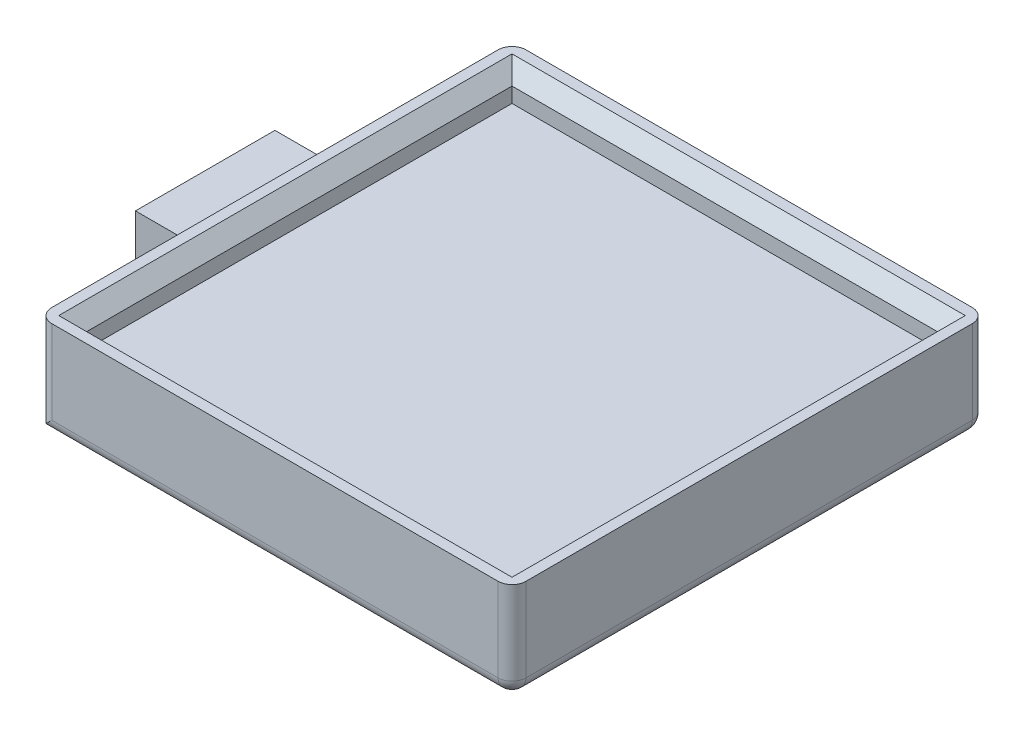
ISO-10303-21;
HEADER;
FILE_DESCRIPTION(('STEP AP214'),'2;1');
FILE_NAME('part.step','',(''),(''),'','','');
FILE_SCHEMA(('AUTOMOTIVE_DESIGN { 1 0 10303 214 1 1 1 1 }'));
ENDSEC;
DATA;
#1=APPLICATION_CONTEXT('core data for automotive mechanical design processes');
#2=APPLICATION_PROTOCOL_DEFINITION('international standard','automotive_design',2000,#1);
#3=PRODUCT_CONTEXT('',#1,'mechanical');
#4=PRODUCT('Part','Part','',(#3));
#5=PRODUCT_RELATED_PRODUCT_CATEGORY('part','',(#4));
#6=PRODUCT_DEFINITION_FORMATION('','',#4);
#7=PRODUCT_DEFINITION_CONTEXT('part definition',#1,'design');
#8=PRODUCT_DEFINITION('design','',#6,#7);
#9=PRODUCT_DEFINITION_SHAPE('','',#8);
#10=(LENGTH_UNIT() NAMED_UNIT(*) SI_UNIT(.MILLI.,.METRE.));
#11=(NAMED_UNIT(*) PLANE_ANGLE_UNIT() SI_UNIT($,.RADIAN.));
#12=(NAMED_UNIT(*) SI_UNIT($,.STERADIAN.) SOLID_ANGLE_UNIT());
#13=UNCERTAINTY_MEASURE_WITH_UNIT(LENGTH_MEASURE(1.E-05),#10,'distance_accuracy_value','');
#14=(GEOMETRIC_REPRESENTATION_CONTEXT(3) GLOBAL_UNCERTAINTY_ASSIGNED_CONTEXT((#13)) GLOBAL_UNIT_ASSIGNED_CONTEXT((#10,
#11,#12)) REPRESENTATION_CONTEXT('',''));
#15=CARTESIAN_POINT('',(0.,0.,0.));
#16=DIRECTION('',(0.,0.,1.));
#17=DIRECTION('',(1.,0.,0.));
#18=AXIS2_PLACEMENT_3D('',#15,#16,#17);
#19=CARTESIAN_POINT('',(0.,5.,0.));
#20=DIRECTION('',(0.,-1.,0.));
#21=DIRECTION('',(0.,0.,-1.));
#22=AXIS2_PLACEMENT_3D('',#19,#20,#21);
#23=PLANE('',#22);
#24=DIRECTION('',(0.,0.,1.));
#25=VECTOR('',#24,1.);
#26=CARTESIAN_POINT('',(5.,5.,0.));
#27=LINE('',#26,#25);
#28=CARTESIAN_POINT('',(5.,5.,-10.));
#29=VERTEX_POINT('',#28);
#30=CARTESIAN_POINT('',(5.,5.,0.));
#31=VERTEX_POINT('',#30);
#32=EDGE_CURVE('E268',#29,#31,#27,.T.);
#33=ORIENTED_EDGE('',*,*,#32,.F.);
#34=DIRECTION('',(1.,0.,0.));
#35=VECTOR('',#34,1.);
#36=CARTESIAN_POINT('',(0.,5.,-10.));
#37=LINE('',#36,#35);
#38=CARTESIAN_POINT('',(0.,5.,-10.));
#39=VERTEX_POINT('',#38);
#40=EDGE_CURVE('E282',#39,#29,#37,.T.);
#41=ORIENTED_EDGE('',*,*,#40,.F.);
#42=DIRECTION('',(0.,0.,-1.));
#43=VECTOR('',#42,1.);
#44=CARTESIAN_POINT('',(0.,5.,0.));
#45=LINE('',#44,#43);
#46=CARTESIAN_POINT('',(0.,5.,0.));
#47=VERTEX_POINT('',#46);
#48=EDGE_CURVE('E277',#47,#39,#45,.T.);
#49=ORIENTED_EDGE('',*,*,#48,.F.);
#50=DIRECTION('',(-1.,0.,0.));
#51=VECTOR('',#50,1.);
#52=CARTESIAN_POINT('',(5.,5.,0.));
#53=LINE('',#52,#51);
#54=EDGE_CURVE('E273',#31,#47,#53,.T.);
#55=ORIENTED_EDGE('',*,*,#54,.F.);
#56=EDGE_LOOP('',(#33,#41,#49,#55));
#57=FACE_BOUND('',#56,.T.);
#58=ADVANCED_FACE('F73',(#57),#23,.F.);
#59=CARTESIAN_POINT('',(5.,5.,0.));
#60=DIRECTION('',(0.,0.,1.));
#61=DIRECTION('',(1.,0.,0.));
#62=AXIS2_PLACEMENT_3D('',#59,#60,#61);
#63=PLANE('',#62);
#64=DIRECTION('',(-1.,0.,0.));
#65=VECTOR('',#64,1.);
#66=CARTESIAN_POINT('',(5.,0.,0.));
#67=LINE('',#66,#65);
#68=CARTESIAN_POINT('',(5.,0.,0.));
#69=VERTEX_POINT('',#68);
#70=CARTESIAN_POINT('',(0.,0.,0.));
#71=VERTEX_POINT('',#70);
#72=EDGE_CURVE('E267',#69,#71,#67,.T.);
#73=ORIENTED_EDGE('',*,*,#72,.F.);
#74=DIRECTION('',(0.,-1.,0.));
#75=VECTOR('',#74,1.);
#76=CARTESIAN_POINT('',(5.,5.,0.));
#77=LINE('',#76,#75);
#78=EDGE_CURVE('E272',#31,#69,#77,.T.);
#79=ORIENTED_EDGE('',*,*,#78,.F.);
#80=ORIENTED_EDGE('',*,*,#54,.T.);
#81=DIRECTION('',(0.,-1.,0.));
#82=VECTOR('',#81,1.);
#83=CARTESIAN_POINT('',(0.,5.,0.));
#84=LINE('',#83,#82);
#85=EDGE_CURVE('E286',#47,#71,#84,.T.);
#86=ORIENTED_EDGE('',*,*,#85,.T.);
#87=EDGE_LOOP('',(#73,#79,#80,#86));
#88=FACE_BOUND('',#87,.T.);
#89=ADVANCED_FACE('F492',(#88),#63,.T.);
#90=CARTESIAN_POINT('',(5.,5.,12.));
#91=DIRECTION('',(-1.,0.,0.));
#92=DIRECTION('',(0.,0.,1.));
#93=AXIS2_PLACEMENT_3D('',#90,#91,#92);
#94=PLANE('',#93);
#95=DIRECTION('',(0.,0.,-1.));
#96=VECTOR('',#95,1.);
#97=CARTESIAN_POINT('',(5.,0.,12.));
#98=LINE('',#97,#96);
#99=CARTESIAN_POINT('',(5.,0.,11.));
#100=VERTEX_POINT('',#99);
#101=EDGE_CURVE('E278',#100,#69,#98,.T.);
#102=ORIENTED_EDGE('',*,*,#101,.F.);
#103=DIRECTION('',(0.,-1.,0.));
#104=VECTOR('',#103,1.);
#105=CARTESIAN_POINT('',(5.,5.,11.));
#106=LINE('',#105,#104);
#107=CARTESIAN_POINT('',(5.,7.,11.));
#108=VERTEX_POINT('',#107);
#109=EDGE_CURVE('E361',#100,#108,#106,.F.);
#110=ORIENTED_EDGE('',*,*,#109,.T.);
#111=DIRECTION('',(0.,0.,1.));
#112=VECTOR('',#111,1.);
#113=CARTESIAN_POINT('',(5.,7.,0.));
#114=LINE('',#113,#112);
#115=CARTESIAN_POINT('',(4.99999999999999,7.,-21.));
#116=VERTEX_POINT('',#115);
#117=EDGE_CURVE('E245',#116,#108,#114,.T.);
#118=ORIENTED_EDGE('',*,*,#117,.F.);
#119=DIRECTION('',(0.,-1.,0.));
#120=VECTOR('',#119,1.);
#121=CARTESIAN_POINT('',(5.,5.,-21.));
#122=LINE('',#121,#120);
#123=CARTESIAN_POINT('',(4.99999999999999,0.,-21.));
#124=VERTEX_POINT('',#123);
#125=EDGE_CURVE('E358',#116,#124,#122,.T.);
#126=ORIENTED_EDGE('',*,*,#125,.T.);
#127=DIRECTION('',(0.,0.,-1.));
#128=VECTOR('',#127,1.);
#129=CARTESIAN_POINT('',(4.99999999999999,0.,-10.));
#130=LINE('',#129,#128);
#131=CARTESIAN_POINT('',(4.99999999999999,0.,-10.));
#132=VERTEX_POINT('',#131);
#133=EDGE_CURVE('E298',#132,#124,#130,.T.);
#134=ORIENTED_EDGE('',*,*,#133,.F.);
#135=DIRECTION('',(0.,-1.,0.));
#136=VECTOR('',#135,1.);
#137=CARTESIAN_POINT('',(4.99999999999999,5.,-10.));
#138=LINE('',#137,#136);
#139=EDGE_CURVE('E307',#29,#132,#138,.T.);
#140=ORIENTED_EDGE('',*,*,#139,.F.);
#141=ORIENTED_EDGE('',*,*,#32,.T.);
#142=ORIENTED_EDGE('',*,*,#78,.T.);
#143=EDGE_LOOP('',(#102,#110,#118,#126,#134,#140,#141,#142));
#144=FACE_BOUND('',#143,.T.);
#145=ADVANCED_FACE('F463',(#144),#94,.T.);
#146=CARTESIAN_POINT('',(39.,5.,12.));
#147=DIRECTION('',(0.,0.,1.));
#148=DIRECTION('',(1.,0.,0.));
#149=AXIS2_PLACEMENT_3D('',#146,#147,#148);
#150=PLANE('',#149);
#151=DIRECTION('',(1.,0.,0.));
#152=VECTOR('',#151,1.);
#153=CARTESIAN_POINT('',(0.,7.,12.));
#154=LINE('',#153,#152);
#155=CARTESIAN_POINT('',(6.00000000000001,7.,12.));
#156=VERTEX_POINT('',#155);
#157=CARTESIAN_POINT('',(38.,7.,12.));
#158=VERTEX_POINT('',#157);
#159=EDGE_CURVE('E255',#156,#158,#154,.T.);
#160=ORIENTED_EDGE('',*,*,#159,.F.);
#161=DIRECTION('',(0.,-1.,0.));
#162=VECTOR('',#161,1.);
#163=CARTESIAN_POINT('',(6.00000000000001,5.,12.));
#164=LINE('',#163,#162);
#165=CARTESIAN_POINT('',(6.00000000000001,1.,12.));
#166=VERTEX_POINT('',#165);
#167=EDGE_CURVE('E354',#156,#166,#164,.T.);
#168=ORIENTED_EDGE('',*,*,#167,.T.);
#169=DIRECTION('',(-1.,0.,0.));
#170=VECTOR('',#169,1.);
#171=CARTESIAN_POINT('',(39.,1.,12.));
#172=LINE('',#171,#170);
#173=CARTESIAN_POINT('',(38.,1.,12.));
#174=VERTEX_POINT('',#173);
#175=EDGE_CURVE('E351',#166,#174,#172,.F.);
#176=ORIENTED_EDGE('',*,*,#175,.T.);
#177=DIRECTION('',(0.,-1.,0.));
#178=VECTOR('',#177,1.);
#179=CARTESIAN_POINT('',(38.,5.,12.));
#180=LINE('',#179,#178);
#181=EDGE_CURVE('E339',#174,#158,#180,.F.);
#182=ORIENTED_EDGE('',*,*,#181,.T.);
#183=EDGE_LOOP('',(#160,#168,#176,#182));
#184=FACE_BOUND('',#183,.T.);
#185=ADVANCED_FACE('F473',(#184),#150,.T.);
#186=CARTESIAN_POINT('',(39.,5.,-22.));
#187=DIRECTION('',(1.,0.,0.));
#188=DIRECTION('',(0.,0.,-1.));
#189=AXIS2_PLACEMENT_3D('',#186,#187,#188);
#190=PLANE('',#189);
#191=DIRECTION('',(0.,0.,-1.));
#192=VECTOR('',#191,1.);
#193=CARTESIAN_POINT('',(39.,7.,0.));
#194=LINE('',#193,#192);
#195=CARTESIAN_POINT('',(39.,7.,11.));
#196=VERTEX_POINT('',#195);
#197=CARTESIAN_POINT('',(39.,7.,-21.));
#198=VERTEX_POINT('',#197);
#199=EDGE_CURVE('E259',#196,#198,#194,.T.);
#200=ORIENTED_EDGE('',*,*,#199,.F.);
#201=DIRECTION('',(0.,-1.,0.));
#202=VECTOR('',#201,1.);
#203=CARTESIAN_POINT('',(39.,5.,11.));
#204=LINE('',#203,#202);
#205=CARTESIAN_POINT('',(39.,1.,11.));
#206=VERTEX_POINT('',#205);
#207=EDGE_CURVE('E12',#196,#206,#204,.T.);
#208=ORIENTED_EDGE('',*,*,#207,.T.);
#209=DIRECTION('',(0.,0.,1.));
#210=VECTOR('',#209,1.);
#211=CARTESIAN_POINT('',(39.,1.,-22.));
#212=LINE('',#211,#210);
#213=CARTESIAN_POINT('',(39.,1.,-21.));
#214=VERTEX_POINT('',#213);
#215=EDGE_CURVE('E83',#206,#214,#212,.F.);
#216=ORIENTED_EDGE('',*,*,#215,.T.);
#217=DIRECTION('',(0.,-1.,0.));
#218=VECTOR('',#217,1.);
#219=CARTESIAN_POINT('',(39.,5.,-21.));
#220=LINE('',#219,#218);
#221=EDGE_CURVE('E394',#214,#198,#220,.F.);
#222=ORIENTED_EDGE('',*,*,#221,.T.);
#223=EDGE_LOOP('',(#200,#208,#216,#222));
#224=FACE_BOUND('',#223,.T.);
#225=ADVANCED_FACE('F511',(#224),#190,.T.);
#226=CARTESIAN_POINT('',(4.99999999999999,5.,-22.));
#227=DIRECTION('',(0.,0.,-1.));
#228=DIRECTION('',(-1.,0.,0.));
#229=AXIS2_PLACEMENT_3D('',#226,#227,#228);
#230=PLANE('',#229);
#231=DIRECTION('',(1.,0.,0.));
#232=VECTOR('',#231,1.);
#233=CARTESIAN_POINT('',(4.99999999999999,1.,-22.));
#234=LINE('',#233,#232);
#235=CARTESIAN_POINT('',(38.,1.,-22.));
#236=VERTEX_POINT('',#235);
#237=CARTESIAN_POINT('',(6.,1.,-22.));
#238=VERTEX_POINT('',#237);
#239=EDGE_CURVE('E388',#236,#238,#234,.F.);
#240=ORIENTED_EDGE('',*,*,#239,.T.);
#241=DIRECTION('',(0.,-1.,0.));
#242=VECTOR('',#241,1.);
#243=CARTESIAN_POINT('',(6.,5.,-22.));
#244=LINE('',#243,#242);
#245=CARTESIAN_POINT('',(6.,7.,-22.));
#246=VERTEX_POINT('',#245);
#247=EDGE_CURVE('E391',#238,#246,#244,.F.);
#248=ORIENTED_EDGE('',*,*,#247,.T.);
#249=DIRECTION('',(1.,0.,0.));
#250=VECTOR('',#249,1.);
#251=CARTESIAN_POINT('',(0.,7.,-22.));
#252=LINE('',#251,#250);
#253=CARTESIAN_POINT('',(38.,7.,-22.));
#254=VERTEX_POINT('',#253);
#255=EDGE_CURVE('E263',#246,#254,#252,.T.);
#256=ORIENTED_EDGE('',*,*,#255,.T.);
#257=DIRECTION('',(0.,-1.,0.));
#258=VECTOR('',#257,1.);
#259=CARTESIAN_POINT('',(38.,5.,-22.));
#260=LINE('',#259,#258);
#261=EDGE_CURVE('E385',#254,#236,#260,.T.);
#262=ORIENTED_EDGE('',*,*,#261,.T.);
#263=EDGE_LOOP('',(#240,#248,#256,#262));
#264=FACE_BOUND('',#263,.T.);
#265=ADVANCED_FACE('F441',(#264),#230,.T.);
#266=CARTESIAN_POINT('',(0.,5.,-10.));
#267=DIRECTION('',(0.,0.,-1.));
#268=DIRECTION('',(-1.,0.,0.));
#269=AXIS2_PLACEMENT_3D('',#266,#267,#268);
#270=PLANE('',#269);
#271=DIRECTION('',(1.,0.,0.));
#272=VECTOR('',#271,1.);
#273=CARTESIAN_POINT('',(0.,0.,-10.));
#274=LINE('',#273,#272);
#275=CARTESIAN_POINT('',(0.,0.,-10.));
#276=VERTEX_POINT('',#275);
#277=EDGE_CURVE('E294',#276,#132,#274,.T.);
#278=ORIENTED_EDGE('',*,*,#277,.F.);
#279=DIRECTION('',(0.,-1.,0.));
#280=VECTOR('',#279,1.);
#281=CARTESIAN_POINT('',(0.,5.,-10.));
#282=LINE('',#281,#280);
#283=EDGE_CURVE('E310',#39,#276,#282,.T.);
#284=ORIENTED_EDGE('',*,*,#283,.F.);
#285=ORIENTED_EDGE('',*,*,#40,.T.);
#286=ORIENTED_EDGE('',*,*,#139,.T.);
#287=EDGE_LOOP('',(#278,#284,#285,#286));
#288=FACE_BOUND('',#287,.T.);
#289=ADVANCED_FACE('F516',(#288),#270,.T.);
#290=CARTESIAN_POINT('',(0.,5.,0.));
#291=DIRECTION('',(-1.,0.,0.));
#292=DIRECTION('',(0.,0.,1.));
#293=AXIS2_PLACEMENT_3D('',#290,#291,#292);
#294=PLANE('',#293);
#295=DIRECTION('',(0.,0.,-1.));
#296=VECTOR('',#295,1.);
#297=CARTESIAN_POINT('',(0.,0.,0.));
#298=LINE('',#297,#296);
#299=EDGE_CURVE('E290',#71,#276,#298,.T.);
#300=ORIENTED_EDGE('',*,*,#299,.F.);
#301=ORIENTED_EDGE('',*,*,#85,.F.);
#302=ORIENTED_EDGE('',*,*,#48,.T.);
#303=ORIENTED_EDGE('',*,*,#283,.T.);
#304=EDGE_LOOP('',(#300,#301,#302,#303));
#305=FACE_BOUND('',#304,.T.);
#306=ADVANCED_FACE('F506',(#305),#294,.T.);
#307=CARTESIAN_POINT('',(0.,0.,0.));
#308=DIRECTION('',(0.,-1.,0.));
#309=DIRECTION('',(0.,0.,-1.));
#310=AXIS2_PLACEMENT_3D('',#307,#308,#309);
#311=PLANE('',#310);
#312=DIRECTION('',(0.,0.,1.));
#313=VECTOR('',#312,1.);
#314=CARTESIAN_POINT('',(38.,0.,0.));
#315=LINE('',#314,#313);
#316=CARTESIAN_POINT('',(38.,0.,-21.));
#317=VERTEX_POINT('',#316);
#318=CARTESIAN_POINT('',(38.,0.,11.));
#319=VERTEX_POINT('',#318);
#320=EDGE_CURVE('E376',#317,#319,#315,.T.);
#321=ORIENTED_EDGE('',*,*,#320,.T.);
#322=DIRECTION('',(-1.,0.,0.));
#323=VECTOR('',#322,1.);
#324=CARTESIAN_POINT('',(0.,0.,11.));
#325=LINE('',#324,#323);
#326=EDGE_CURVE('E382',#319,#100,#325,.T.);
#327=ORIENTED_EDGE('',*,*,#326,.T.);
#328=ORIENTED_EDGE('',*,*,#101,.T.);
#329=ORIENTED_EDGE('',*,*,#72,.T.);
#330=ORIENTED_EDGE('',*,*,#299,.T.);
#331=ORIENTED_EDGE('',*,*,#277,.T.);
#332=ORIENTED_EDGE('',*,*,#133,.T.);
#333=DIRECTION('',(1.,0.,0.));
#334=VECTOR('',#333,1.);
#335=CARTESIAN_POINT('',(0.,0.,-21.));
#336=LINE('',#335,#334);
#337=EDGE_CURVE('E379',#124,#317,#336,.T.);
#338=ORIENTED_EDGE('',*,*,#337,.T.);
#339=EDGE_LOOP('',(#321,#327,#328,#329,#330,#331,#332,#338));
#340=FACE_BOUND('',#339,.T.);
#341=ADVANCED_FACE('F456',(#340),#311,.T.);
#342=CARTESIAN_POINT('',(0.,7.,0.));
#343=DIRECTION('',(0.,1.,0.));
#344=DIRECTION('',(0.,0.,1.));
#345=AXIS2_PLACEMENT_3D('',#342,#343,#344);
#346=PLANE('',#345);
#347=DIRECTION('',(0.,0.,-1.));
#348=VECTOR('',#347,1.);
#349=CARTESIAN_POINT('',(5.75,7.,-20.25));
#350=LINE('',#349,#348);
#351=CARTESIAN_POINT('',(5.75,7.,11.25));
#352=VERTEX_POINT('',#351);
#353=CARTESIAN_POINT('',(5.75,7.,-21.25));
#354=VERTEX_POINT('',#353);
#355=EDGE_CURVE('E271',#352,#354,#350,.T.);
#356=ORIENTED_EDGE('',*,*,#355,.T.);
#357=DIRECTION('',(1.,0.,0.));
#358=VECTOR('',#357,1.);
#359=CARTESIAN_POINT('',(0.,7.,-21.25));
#360=LINE('',#359,#358);
#361=CARTESIAN_POINT('',(38.25,7.,-21.25));
#362=VERTEX_POINT('',#361);
#363=EDGE_CURVE('E323',#354,#362,#360,.T.);
#364=ORIENTED_EDGE('',*,*,#363,.T.);
#365=DIRECTION('',(0.,0.,1.));
#366=VECTOR('',#365,1.);
#367=CARTESIAN_POINT('',(38.25,7.,0.));
#368=LINE('',#367,#366);
#369=CARTESIAN_POINT('',(38.25,7.,11.25));
#370=VERTEX_POINT('',#369);
#371=EDGE_CURVE('E320',#362,#370,#368,.T.);
#372=ORIENTED_EDGE('',*,*,#371,.T.);
#373=DIRECTION('',(-1.,0.,0.));
#374=VECTOR('',#373,1.);
#375=CARTESIAN_POINT('',(6.75,7.,11.25));
#376=LINE('',#375,#374);
#377=EDGE_CURVE('E317',#370,#352,#376,.T.);
#378=ORIENTED_EDGE('',*,*,#377,.T.);
#379=EDGE_LOOP('',(#356,#364,#372,#378));
#380=FACE_BOUND('',#379,.T.);
#381=ORIENTED_EDGE('',*,*,#117,.T.);
#382=CARTESIAN_POINT('',(6.00000000000001,7.,11.));
#383=DIRECTION('',(0.,1.,0.));
#384=DIRECTION('',(0.,0.,1.));
#385=AXIS2_PLACEMENT_3D('',#382,#383,#384);
#386=CIRCLE('',#385,1.);
#387=EDGE_CURVE('E373',#108,#156,#386,.T.);
#388=ORIENTED_EDGE('',*,*,#387,.T.);
#389=ORIENTED_EDGE('',*,*,#159,.T.);
#390=CARTESIAN_POINT('',(38.,7.,11.));
#391=DIRECTION('',(0.,1.,0.));
#392=DIRECTION('',(0.,0.,1.));
#393=AXIS2_PLACEMENT_3D('',#390,#391,#392);
#394=CIRCLE('',#393,1.);
#395=EDGE_CURVE('E370',#158,#196,#394,.T.);
#396=ORIENTED_EDGE('',*,*,#395,.T.);
#397=ORIENTED_EDGE('',*,*,#199,.T.);
#398=CARTESIAN_POINT('',(38.,7.,-21.));
#399=DIRECTION('',(0.,1.,0.));
#400=DIRECTION('',(0.,0.,1.));
#401=AXIS2_PLACEMENT_3D('',#398,#399,#400);
#402=CIRCLE('',#401,1.);
#403=EDGE_CURVE('E364',#198,#254,#402,.T.);
#404=ORIENTED_EDGE('',*,*,#403,.T.);
#405=ORIENTED_EDGE('',*,*,#255,.F.);
#406=CARTESIAN_POINT('',(6.,7.,-21.));
#407=DIRECTION('',(0.,1.,0.));
#408=DIRECTION('',(0.,0.,1.));
#409=AXIS2_PLACEMENT_3D('',#406,#407,#408);
#410=CIRCLE('',#409,1.);
#411=EDGE_CURVE('E367',#246,#116,#410,.T.);
#412=ORIENTED_EDGE('',*,*,#411,.T.);
#413=EDGE_LOOP('',(#381,#388,#389,#396,#397,#404,#405,#412));
#414=FACE_BOUND('',#413,.T.);
#415=ADVANCED_FACE('F444',(#380,#414),#346,.T.);
#416=CARTESIAN_POINT('',(6.75,4.92,10.25));
#417=DIRECTION('',(0.,0.,1.));
#418=DIRECTION('',(1.,0.,0.));
#419=AXIS2_PLACEMENT_3D('',#416,#417,#418);
#420=PLANE('',#419);
#421=DIRECTION('',(0.,1.,0.));
#422=VECTOR('',#421,1.);
#423=CARTESIAN_POINT('',(6.75,4.92,10.25));
#424=LINE('',#423,#422);
#425=CARTESIAN_POINT('',(6.75,4.92,10.25));
#426=VERTEX_POINT('',#425);
#427=CARTESIAN_POINT('',(6.75,6.00000000000001,10.25));
#428=VERTEX_POINT('',#427);
#429=EDGE_CURVE('E242',#426,#428,#424,.T.);
#430=ORIENTED_EDGE('',*,*,#429,.T.);
#431=DIRECTION('',(1.,0.,0.));
#432=VECTOR('',#431,1.);
#433=CARTESIAN_POINT('',(37.25,6.00000000000001,10.25));
#434=LINE('',#433,#432);
#435=CARTESIAN_POINT('',(37.25,6.00000000000001,10.25));
#436=VERTEX_POINT('',#435);
#437=EDGE_CURVE('E224',#428,#436,#434,.T.);
#438=ORIENTED_EDGE('',*,*,#437,.T.);
#439=DIRECTION('',(0.,1.,0.));
#440=VECTOR('',#439,1.);
#441=CARTESIAN_POINT('',(37.25,4.92,10.25));
#442=LINE('',#441,#440);
#443=CARTESIAN_POINT('',(37.25,4.92,10.25));
#444=VERTEX_POINT('',#443);
#445=EDGE_CURVE('E207',#444,#436,#442,.T.);
#446=ORIENTED_EDGE('',*,*,#445,.F.);
#447=DIRECTION('',(1.,0.,0.));
#448=VECTOR('',#447,1.);
#449=CARTESIAN_POINT('',(6.75,4.92,10.25));
#450=LINE('',#449,#448);
#451=EDGE_CURVE('E216',#426,#444,#450,.T.);
#452=ORIENTED_EDGE('',*,*,#451,.F.);
#453=EDGE_LOOP('',(#430,#438,#446,#452));
#454=FACE_BOUND('',#453,.T.);
#455=ADVANCED_FACE('F221',(#454),#420,.F.);
#456=CARTESIAN_POINT('',(6.74999999999999,4.92,-20.25));
#457=DIRECTION('',(-1.,0.,0.));
#458=DIRECTION('',(0.,0.,1.));
#459=AXIS2_PLACEMENT_3D('',#456,#457,#458);
#460=PLANE('',#459);
#461=DIRECTION('',(0.,1.,0.));
#462=VECTOR('',#461,1.);
#463=CARTESIAN_POINT('',(6.74999999999999,4.92,-20.25));
#464=LINE('',#463,#462);
#465=CARTESIAN_POINT('',(6.74999999999999,4.92,-20.25));
#466=VERTEX_POINT('',#465);
#467=CARTESIAN_POINT('',(6.74999999999999,6.00000000000001,-20.25));
#468=VERTEX_POINT('',#467);
#469=EDGE_CURVE('E246',#466,#468,#464,.T.);
#470=ORIENTED_EDGE('',*,*,#469,.T.);
#471=DIRECTION('',(0.,0.,1.));
#472=VECTOR('',#471,1.);
#473=CARTESIAN_POINT('',(6.75,6.00000000000001,10.25));
#474=LINE('',#473,#472);
#475=EDGE_CURVE('E336',#468,#428,#474,.T.);
#476=ORIENTED_EDGE('',*,*,#475,.T.);
#477=ORIENTED_EDGE('',*,*,#429,.F.);
#478=DIRECTION('',(0.,0.,1.));
#479=VECTOR('',#478,1.);
#480=CARTESIAN_POINT('',(6.74999999999999,4.92,-20.25));
#481=LINE('',#480,#479);
#482=EDGE_CURVE('E226',#466,#426,#481,.T.);
#483=ORIENTED_EDGE('',*,*,#482,.F.);
#484=EDGE_LOOP('',(#470,#476,#477,#483));
#485=FACE_BOUND('',#484,.T.);
#486=ADVANCED_FACE('F567',(#485),#460,.F.);
#487=CARTESIAN_POINT('',(6.74999999999999,4.92,-20.25));
#488=DIRECTION('',(0.,0.,1.));
#489=DIRECTION('',(1.,0.,0.));
#490=AXIS2_PLACEMENT_3D('',#487,#488,#489);
#491=PLANE('',#490);
#492=DIRECTION('',(0.,1.,0.));
#493=VECTOR('',#492,1.);
#494=CARTESIAN_POINT('',(37.25,4.92,-20.25));
#495=LINE('',#494,#493);
#496=CARTESIAN_POINT('',(37.25,4.92,-20.25));
#497=VERTEX_POINT('',#496);
#498=CARTESIAN_POINT('',(37.25,6.00000000000001,-20.25));
#499=VERTEX_POINT('',#498);
#500=EDGE_CURVE('E210',#497,#499,#495,.T.);
#501=ORIENTED_EDGE('',*,*,#500,.T.);
#502=DIRECTION('',(-1.,0.,0.));
#503=VECTOR('',#502,1.);
#504=CARTESIAN_POINT('',(6.74999999999999,6.00000000000001,-20.25));
#505=LINE('',#504,#503);
#506=EDGE_CURVE('E327',#499,#468,#505,.T.);
#507=ORIENTED_EDGE('',*,*,#506,.T.);
#508=ORIENTED_EDGE('',*,*,#469,.F.);
#509=DIRECTION('',(1.,0.,0.));
#510=VECTOR('',#509,1.);
#511=CARTESIAN_POINT('',(6.74999999999999,4.92,-20.25));
#512=LINE('',#511,#510);
#513=EDGE_CURVE('E215',#466,#497,#512,.T.);
#514=ORIENTED_EDGE('',*,*,#513,.T.);
#515=EDGE_LOOP('',(#501,#507,#508,#514));
#516=FACE_BOUND('',#515,.T.);
#517=ADVANCED_FACE('F561',(#516),#491,.T.);
#518=CARTESIAN_POINT('',(37.25,4.92,-20.25));
#519=DIRECTION('',(-1.,0.,0.));
#520=DIRECTION('',(0.,0.,1.));
#521=AXIS2_PLACEMENT_3D('',#518,#519,#520);
#522=PLANE('',#521);
#523=ORIENTED_EDGE('',*,*,#445,.T.);
#524=DIRECTION('',(0.,0.,-1.));
#525=VECTOR('',#524,1.);
#526=CARTESIAN_POINT('',(37.25,6.00000000000001,-20.25));
#527=LINE('',#526,#525);
#528=EDGE_CURVE('E331',#436,#499,#527,.T.);
#529=ORIENTED_EDGE('',*,*,#528,.T.);
#530=ORIENTED_EDGE('',*,*,#500,.F.);
#531=DIRECTION('',(0.,0.,1.));
#532=VECTOR('',#531,1.);
#533=CARTESIAN_POINT('',(37.25,4.92,-20.25));
#534=LINE('',#533,#532);
#535=EDGE_CURVE('E204',#497,#444,#534,.T.);
#536=ORIENTED_EDGE('',*,*,#535,.T.);
#537=EDGE_LOOP('',(#523,#529,#530,#536));
#538=FACE_BOUND('',#537,.T.);
#539=ADVANCED_FACE('F206',(#538),#522,.T.);
#540=CARTESIAN_POINT('',(0.,4.92,0.));
#541=DIRECTION('',(0.,-1.,0.));
#542=DIRECTION('',(0.,0.,-1.));
#543=AXIS2_PLACEMENT_3D('',#540,#541,#542);
#544=PLANE('',#543);
#545=ORIENTED_EDGE('',*,*,#451,.T.);
#546=ORIENTED_EDGE('',*,*,#535,.F.);
#547=ORIENTED_EDGE('',*,*,#513,.F.);
#548=ORIENTED_EDGE('',*,*,#482,.T.);
#549=EDGE_LOOP('',(#545,#546,#547,#548));
#550=FACE_BOUND('',#549,.T.);
#551=ADVANCED_FACE('F228',(#550),#544,.F.);
#552=CARTESIAN_POINT('',(6.75,6.00000000000001,10.25));
#553=DIRECTION('',(0.,0.707106781186547,-0.707106781186548));
#554=DIRECTION('',(-1.,0.,0.));
#555=AXIS2_PLACEMENT_3D('',#552,#553,#554);
#556=PLANE('',#555);
#557=DIRECTION('',(0.577350269189626,0.577350269189626,0.577350269189626));
#558=VECTOR('',#557,1.);
#559=CARTESIAN_POINT('',(34.5,3.25,7.5));
#560=LINE('',#559,#558);
#561=EDGE_CURVE('E235',#436,#370,#560,.T.);
#562=ORIENTED_EDGE('',*,*,#561,.F.);
#563=ORIENTED_EDGE('',*,*,#437,.F.);
#564=DIRECTION('',(0.577350269189626,-0.577350269189626,-0.577350269189626));
#565=VECTOR('',#564,1.);
#566=CARTESIAN_POINT('',(6.75,6.00000000000001,10.25));
#567=LINE('',#566,#565);
#568=EDGE_CURVE('E231',#352,#428,#567,.T.);
#569=ORIENTED_EDGE('',*,*,#568,.F.);
#570=ORIENTED_EDGE('',*,*,#377,.F.);
#571=EDGE_LOOP('',(#562,#563,#569,#570));
#572=FACE_BOUND('',#571,.T.);
#573=ADVANCED_FACE('F543',(#572),#556,.T.);
#574=CARTESIAN_POINT('',(6.74999999999999,6.00000000000001,-20.25));
#575=DIRECTION('',(0.707106781186547,0.707106781186547,0.));
#576=DIRECTION('',(0.,0.,-1.));
#577=AXIS2_PLACEMENT_3D('',#574,#575,#576);
#578=PLANE('',#577);
#579=ORIENTED_EDGE('',*,*,#568,.T.);
#580=ORIENTED_EDGE('',*,*,#475,.F.);
#581=DIRECTION('',(0.577350269189626,-0.577350269189626,0.577350269189626));
#582=VECTOR('',#581,1.);
#583=CARTESIAN_POINT('',(3.83333333333333,8.91666666666667,-23.1666666666667));
#584=LINE('',#583,#582);
#585=EDGE_CURVE('E343',#354,#468,#584,.T.);
#586=ORIENTED_EDGE('',*,*,#585,.F.);
#587=ORIENTED_EDGE('',*,*,#355,.F.);
#588=EDGE_LOOP('',(#579,#580,#586,#587));
#589=FACE_BOUND('',#588,.T.);
#590=ADVANCED_FACE('F536',(#589),#578,.T.);
#591=CARTESIAN_POINT('',(38.25,7.,0.));
#592=DIRECTION('',(0.707106781186547,-0.707106781186547,0.));
#593=DIRECTION('',(0.,0.,1.));
#594=AXIS2_PLACEMENT_3D('',#591,#592,#593);
#595=PLANE('',#594);
#596=ORIENTED_EDGE('',*,*,#561,.T.);
#597=ORIENTED_EDGE('',*,*,#371,.F.);
#598=DIRECTION('',(-0.577350269189626,-0.577350269189626,0.577350269189626));
#599=VECTOR('',#598,1.);
#600=CARTESIAN_POINT('',(25.5,-5.75,-8.49999999999999));
#601=LINE('',#600,#599);
#602=EDGE_CURVE('E340',#499,#362,#601,.F.);
#603=ORIENTED_EDGE('',*,*,#602,.F.);
#604=ORIENTED_EDGE('',*,*,#528,.F.);
#605=EDGE_LOOP('',(#596,#597,#603,#604));
#606=FACE_BOUND('',#605,.T.);
#607=ADVANCED_FACE('F529',(#606),#595,.F.);
#608=CARTESIAN_POINT('',(0.,7.,-21.25));
#609=DIRECTION('',(0.,-0.707106781186547,-0.707106781186547));
#610=DIRECTION('',(1.,0.,0.));
#611=AXIS2_PLACEMENT_3D('',#608,#609,#610);
#612=PLANE('',#611);
#613=ORIENTED_EDGE('',*,*,#585,.T.);
#614=ORIENTED_EDGE('',*,*,#506,.F.);
#615=ORIENTED_EDGE('',*,*,#602,.T.);
#616=ORIENTED_EDGE('',*,*,#363,.F.);
#617=EDGE_LOOP('',(#613,#614,#615,#616));
#618=FACE_BOUND('',#617,.T.);
#619=ADVANCED_FACE('F523',(#618),#612,.F.);
#620=CARTESIAN_POINT('',(6.,5.,-21.));
#621=DIRECTION('',(0.,-1.,0.));
#622=DIRECTION('',(0.,0.,-1.));
#623=AXIS2_PLACEMENT_3D('',#620,#621,#622);
#624=CYLINDRICAL_SURFACE('',#623,1.);
#625=ORIENTED_EDGE('',*,*,#411,.F.);
#626=ORIENTED_EDGE('',*,*,#247,.F.);
#627=CARTESIAN_POINT('',(6.,1.,-21.));
#628=DIRECTION('',(0.707106781186547,-0.707106781186547,0.));
#629=DIRECTION('',(-0.707106781186547,-0.707106781186547,0.));
#630=AXIS2_PLACEMENT_3D('',#627,#628,#629);
#631=ELLIPSE('',#630,1.41421356237309,1.);
#632=EDGE_CURVE('E77',#124,#238,#631,.T.);
#633=ORIENTED_EDGE('',*,*,#632,.F.);
#634=ORIENTED_EDGE('',*,*,#125,.F.);
#635=EDGE_LOOP('',(#625,#626,#633,#634));
#636=FACE_BOUND('',#635,.T.);
#637=ADVANCED_FACE('F75',(#636),#624,.T.);
#638=CARTESIAN_POINT('',(38.,5.,-21.));
#639=DIRECTION('',(0.,-1.,0.));
#640=DIRECTION('',(0.,0.,-1.));
#641=AXIS2_PLACEMENT_3D('',#638,#639,#640);
#642=CYLINDRICAL_SURFACE('',#641,1.);
#643=ORIENTED_EDGE('',*,*,#403,.F.);
#644=ORIENTED_EDGE('',*,*,#221,.F.);
#645=CARTESIAN_POINT('',(38.,1.,-21.));
#646=DIRECTION('',(0.,-1.,0.));
#647=DIRECTION('',(0.,0.,-1.));
#648=AXIS2_PLACEMENT_3D('',#645,#646,#647);
#649=CIRCLE('',#648,1.);
#650=EDGE_CURVE('E421',#236,#214,#649,.T.);
#651=ORIENTED_EDGE('',*,*,#650,.F.);
#652=ORIENTED_EDGE('',*,*,#261,.F.);
#653=EDGE_LOOP('',(#643,#644,#651,#652));
#654=FACE_BOUND('',#653,.T.);
#655=ADVANCED_FACE('F448',(#654),#642,.T.);
#656=CARTESIAN_POINT('',(0.,1.,-21.));
#657=DIRECTION('',(1.,0.,0.));
#658=DIRECTION('',(0.,0.,-1.));
#659=AXIS2_PLACEMENT_3D('',#656,#657,#658);
#660=CYLINDRICAL_SURFACE('',#659,1.);
#661=ORIENTED_EDGE('',*,*,#632,.T.);
#662=ORIENTED_EDGE('',*,*,#239,.F.);
#663=CARTESIAN_POINT('',(38.,1.,-21.));
#664=DIRECTION('',(1.,0.,0.));
#665=DIRECTION('',(0.,0.,-1.));
#666=AXIS2_PLACEMENT_3D('',#663,#664,#665);
#667=CIRCLE('',#666,1.);
#668=EDGE_CURVE('E418',#317,#236,#667,.T.);
#669=ORIENTED_EDGE('',*,*,#668,.F.);
#670=ORIENTED_EDGE('',*,*,#337,.F.);
#671=EDGE_LOOP('',(#661,#662,#669,#670));
#672=FACE_BOUND('',#671,.T.);
#673=ADVANCED_FACE('F433',(#672),#660,.T.);
#674=CARTESIAN_POINT('',(38.,1.,-21.));
#675=DIRECTION('',(0.,0.,-1.));
#676=DIRECTION('',(-1.,0.,0.));
#677=AXIS2_PLACEMENT_3D('',#674,#675,#676);
#678=SPHERICAL_SURFACE('',#677,1.);
#679=ORIENTED_EDGE('',*,*,#668,.T.);
#680=ORIENTED_EDGE('',*,*,#650,.T.);
#681=CARTESIAN_POINT('',(38.,1.,-21.));
#682=DIRECTION('',(0.,0.,-1.));
#683=DIRECTION('',(-1.,0.,0.));
#684=AXIS2_PLACEMENT_3D('',#681,#682,#683);
#685=CIRCLE('',#684,1.);
#686=EDGE_CURVE('E414',#317,#214,#685,.F.);
#687=ORIENTED_EDGE('',*,*,#686,.F.);
#688=EDGE_LOOP('',(#679,#680,#687));
#689=FACE_BOUND('',#688,.T.);
#690=ADVANCED_FACE('F449',(#689),#678,.T.);
#691=CARTESIAN_POINT('',(38.,5.,11.));
#692=DIRECTION('',(0.,-1.,0.));
#693=DIRECTION('',(0.,0.,-1.));
#694=AXIS2_PLACEMENT_3D('',#691,#692,#693);
#695=CYLINDRICAL_SURFACE('',#694,1.);
#696=ORIENTED_EDGE('',*,*,#395,.F.);
#697=ORIENTED_EDGE('',*,*,#181,.F.);
#698=CARTESIAN_POINT('',(38.,1.,11.));
#699=DIRECTION('',(0.,-1.,0.));
#700=DIRECTION('',(0.,0.,-1.));
#701=AXIS2_PLACEMENT_3D('',#698,#699,#700);
#702=CIRCLE('',#701,1.);
#703=EDGE_CURVE('E410',#206,#174,#702,.T.);
#704=ORIENTED_EDGE('',*,*,#703,.F.);
#705=ORIENTED_EDGE('',*,*,#207,.F.);
#706=EDGE_LOOP('',(#696,#697,#704,#705));
#707=FACE_BOUND('',#706,.T.);
#708=ADVANCED_FACE('F477',(#707),#695,.T.);
#709=CARTESIAN_POINT('',(38.,1.,0.));
#710=DIRECTION('',(0.,0.,1.));
#711=DIRECTION('',(1.,0.,0.));
#712=AXIS2_PLACEMENT_3D('',#709,#710,#711);
#713=CYLINDRICAL_SURFACE('',#712,1.);
#714=ORIENTED_EDGE('',*,*,#686,.T.);
#715=ORIENTED_EDGE('',*,*,#215,.F.);
#716=CARTESIAN_POINT('',(38.,1.,11.));
#717=DIRECTION('',(0.,0.,1.));
#718=DIRECTION('',(1.,0.,0.));
#719=AXIS2_PLACEMENT_3D('',#716,#717,#718);
#720=CIRCLE('',#719,1.);
#721=EDGE_CURVE('E406',#319,#206,#720,.T.);
#722=ORIENTED_EDGE('',*,*,#721,.F.);
#723=ORIENTED_EDGE('',*,*,#320,.F.);
#724=EDGE_LOOP('',(#714,#715,#722,#723));
#725=FACE_BOUND('',#724,.T.);
#726=ADVANCED_FACE('F453',(#725),#713,.T.);
#727=CARTESIAN_POINT('',(38.,1.,11.));
#728=DIRECTION('',(1.,0.,0.));
#729=DIRECTION('',(0.,0.,-1.));
#730=AXIS2_PLACEMENT_3D('',#727,#728,#729);
#731=SPHERICAL_SURFACE('',#730,1.);
#732=ORIENTED_EDGE('',*,*,#721,.T.);
#733=ORIENTED_EDGE('',*,*,#703,.T.);
#734=CARTESIAN_POINT('',(38.,1.,11.));
#735=DIRECTION('',(1.,0.,0.));
#736=DIRECTION('',(0.,0.,-1.));
#737=AXIS2_PLACEMENT_3D('',#734,#735,#736);
#738=CIRCLE('',#737,1.);
#739=EDGE_CURVE('E402',#319,#174,#738,.F.);
#740=ORIENTED_EDGE('',*,*,#739,.F.);
#741=EDGE_LOOP('',(#732,#733,#740));
#742=FACE_BOUND('',#741,.T.);
#743=ADVANCED_FACE('F480',(#742),#731,.T.);
#744=CARTESIAN_POINT('',(0.,1.,11.));
#745=DIRECTION('',(-1.,0.,0.));
#746=DIRECTION('',(0.,0.,1.));
#747=AXIS2_PLACEMENT_3D('',#744,#745,#746);
#748=CYLINDRICAL_SURFACE('',#747,1.);
#749=ORIENTED_EDGE('',*,*,#739,.T.);
#750=ORIENTED_EDGE('',*,*,#175,.F.);
#751=CARTESIAN_POINT('',(6.00000000000001,1.,11.));
#752=DIRECTION('',(-0.707106781186547,0.707106781186547,0.));
#753=DIRECTION('',(-0.707106781186547,-0.707106781186547,0.));
#754=AXIS2_PLACEMENT_3D('',#751,#752,#753);
#755=ELLIPSE('',#754,1.41421356237309,1.);
#756=EDGE_CURVE('E399',#100,#166,#755,.T.);
#757=ORIENTED_EDGE('',*,*,#756,.F.);
#758=ORIENTED_EDGE('',*,*,#326,.F.);
#759=EDGE_LOOP('',(#749,#750,#757,#758));
#760=FACE_BOUND('',#759,.T.);
#761=ADVANCED_FACE('F482',(#760),#748,.T.);
#762=CARTESIAN_POINT('',(6.00000000000001,5.,11.));
#763=DIRECTION('',(0.,-1.,0.));
#764=DIRECTION('',(0.,0.,-1.));
#765=AXIS2_PLACEMENT_3D('',#762,#763,#764);
#766=CYLINDRICAL_SURFACE('',#765,1.);
#767=ORIENTED_EDGE('',*,*,#387,.F.);
#768=ORIENTED_EDGE('',*,*,#109,.F.);
#769=ORIENTED_EDGE('',*,*,#756,.T.);
#770=ORIENTED_EDGE('',*,*,#167,.F.);
#771=EDGE_LOOP('',(#767,#768,#769,#770));
#772=FACE_BOUND('',#771,.T.);
#773=ADVANCED_FACE('F469',(#772),#766,.T.);
#774=CLOSED_SHELL('',(#58,#89,#145,#185,#225,#265,#289,#306,#341,#415,#455,#486,#517,#539,#551,
#573,#590,#607,#619,#637,#655,#673,#690,#708,#726,#743,#761,#773));
#775=MANIFOLD_SOLID_BREP('B2',#774);
#776=ADVANCED_BREP_SHAPE_REPRESENTATION('',(#18,#775),#14);
#777=SHAPE_DEFINITION_REPRESENTATION(#9,#776);
ENDSEC;
END-ISO-10303-21;
